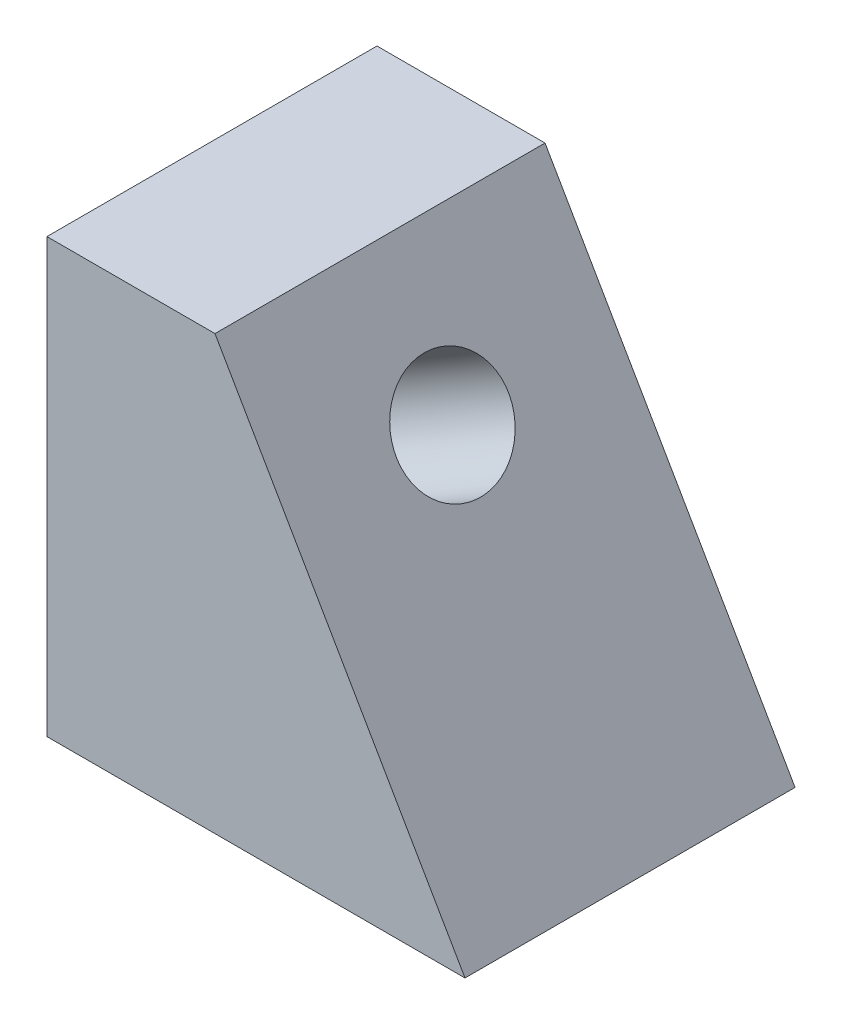
ISO-10303-21;
HEADER;
FILE_DESCRIPTION(('STEP AP214'),'2;1');
FILE_NAME('part.step','',(''),(''),'','','');
FILE_SCHEMA(('AUTOMOTIVE_DESIGN { 1 0 10303 214 1 1 1 1 }'));
ENDSEC;
DATA;
#1=APPLICATION_CONTEXT('core data for automotive mechanical design processes');
#2=APPLICATION_PROTOCOL_DEFINITION('international standard','automotive_design',2000,#1);
#3=PRODUCT_CONTEXT('',#1,'mechanical');
#4=PRODUCT('Part','Part','',(#3));
#5=PRODUCT_RELATED_PRODUCT_CATEGORY('part','',(#4));
#6=PRODUCT_DEFINITION_FORMATION('','',#4);
#7=PRODUCT_DEFINITION_CONTEXT('part definition',#1,'design');
#8=PRODUCT_DEFINITION('design','',#6,#7);
#9=PRODUCT_DEFINITION_SHAPE('','',#8);
#10=(LENGTH_UNIT() NAMED_UNIT(*) SI_UNIT(.MILLI.,.METRE.));
#11=(NAMED_UNIT(*) PLANE_ANGLE_UNIT() SI_UNIT($,.RADIAN.));
#12=(NAMED_UNIT(*) SI_UNIT($,.STERADIAN.) SOLID_ANGLE_UNIT());
#13=UNCERTAINTY_MEASURE_WITH_UNIT(LENGTH_MEASURE(1.E-05),#10,'distance_accuracy_value','');
#14=(GEOMETRIC_REPRESENTATION_CONTEXT(3) GLOBAL_UNCERTAINTY_ASSIGNED_CONTEXT((#13)) GLOBAL_UNIT_ASSIGNED_CONTEXT((#10,
#11,#12)) REPRESENTATION_CONTEXT('',''));
#15=CARTESIAN_POINT('',(0.,0.,0.));
#16=DIRECTION('',(0.,0.,1.));
#17=DIRECTION('',(1.,0.,0.));
#18=AXIS2_PLACEMENT_3D('',#15,#16,#17);
#19=CARTESIAN_POINT('',(0.,0.,50.));
#20=DIRECTION('',(-1.,0.,0.));
#21=DIRECTION('',(0.,0.,1.));
#22=AXIS2_PLACEMENT_3D('',#19,#20,#21);
#23=PLANE('',#22);
#24=CARTESIAN_POINT('',(0.,25.56904553405,25.));
#25=DIRECTION('',(-1.,0.,0.));
#26=DIRECTION('',(0.,1.,0.));
#27=AXIS2_PLACEMENT_3D('',#24,#25,#26);
#28=ELLIPSE('',#27,9.81495457622367,8.5);
#29=CARTESIAN_POINT('',(0.,35.3840001102737,25.));
#30=VERTEX_POINT('',#29);
#31=EDGE_CURVE('E105',#30,#30,#28,.F.);
#32=ORIENTED_EDGE('',*,*,#31,.T.);
#33=EDGE_LOOP('',(#32));
#34=FACE_BOUND('',#33,.T.);
#35=DIRECTION('',(0.,1.,0.));
#36=VECTOR('',#35,1.);
#37=CARTESIAN_POINT('',(0.,0.,0.));
#38=LINE('',#37,#36);
#39=CARTESIAN_POINT('',(0.,0.,0.));
#40=VERTEX_POINT('',#39);
#41=CARTESIAN_POINT('',(0.,65.6065757027782,0.));
#42=VERTEX_POINT('',#41);
#43=EDGE_CURVE('E79',#40,#42,#38,.T.);
#44=ORIENTED_EDGE('',*,*,#43,.F.);
#45=DIRECTION('',(0.,0.,-1.));
#46=VECTOR('',#45,1.);
#47=CARTESIAN_POINT('',(0.,0.,50.));
#48=LINE('',#47,#46);
#49=CARTESIAN_POINT('',(0.,0.,50.));
#50=VERTEX_POINT('',#49);
#51=EDGE_CURVE('E11',#50,#40,#48,.T.);
#52=ORIENTED_EDGE('',*,*,#51,.F.);
#53=DIRECTION('',(0.,1.,0.));
#54=VECTOR('',#53,1.);
#55=CARTESIAN_POINT('',(0.,0.,50.));
#56=LINE('',#55,#54);
#57=CARTESIAN_POINT('',(0.,65.6065757027782,50.));
#58=VERTEX_POINT('',#57);
#59=EDGE_CURVE('E81',#50,#58,#56,.T.);
#60=ORIENTED_EDGE('',*,*,#59,.T.);
#61=DIRECTION('',(0.,0.,-1.));
#62=VECTOR('',#61,1.);
#63=CARTESIAN_POINT('',(0.,65.6065757027782,50.));
#64=LINE('',#63,#62);
#65=EDGE_CURVE('E38',#58,#42,#64,.T.);
#66=ORIENTED_EDGE('',*,*,#65,.T.);
#67=EDGE_LOOP('',(#44,#52,#60,#66));
#68=FACE_BOUND('',#67,.T.);
#69=ADVANCED_FACE('F35',(#34,#68),#23,.T.);
#70=CARTESIAN_POINT('',(0.,0.,50.));
#71=DIRECTION('',(0.,1.,0.));
#72=DIRECTION('',(0.,0.,1.));
#73=AXIS2_PLACEMENT_3D('',#70,#71,#72);
#74=PLANE('',#73);
#75=DIRECTION('',(1.,0.,0.));
#76=VECTOR('',#75,1.);
#77=CARTESIAN_POINT('',(0.,0.,0.));
#78=LINE('',#77,#76);
#79=CARTESIAN_POINT('',(63.335064935065,0.,0.));
#80=VERTEX_POINT('',#79);
#81=EDGE_CURVE('E71',#40,#80,#78,.T.);
#82=ORIENTED_EDGE('',*,*,#81,.T.);
#83=DIRECTION('',(0.,0.,-1.));
#84=VECTOR('',#83,1.);
#85=CARTESIAN_POINT('',(63.335064935065,0.,50.));
#86=LINE('',#85,#84);
#87=CARTESIAN_POINT('',(63.335064935065,0.,50.));
#88=VERTEX_POINT('',#87);
#89=EDGE_CURVE('E44',#88,#80,#86,.T.);
#90=ORIENTED_EDGE('',*,*,#89,.F.);
#91=DIRECTION('',(1.,0.,0.));
#92=VECTOR('',#91,1.);
#93=CARTESIAN_POINT('',(0.,0.,50.));
#94=LINE('',#93,#92);
#95=EDGE_CURVE('E73',#50,#88,#94,.T.);
#96=ORIENTED_EDGE('',*,*,#95,.F.);
#97=ORIENTED_EDGE('',*,*,#51,.T.);
#98=EDGE_LOOP('',(#82,#90,#96,#97));
#99=FACE_BOUND('',#98,.T.);
#100=ADVANCED_FACE('F70',(#99),#74,.F.);
#101=CARTESIAN_POINT('',(0.,65.6065757027782,50.));
#102=DIRECTION('',(0.,1.,0.));
#103=DIRECTION('',(0.,0.,1.));
#104=AXIS2_PLACEMENT_3D('',#101,#102,#103);
#105=PLANE('',#104);
#106=DIRECTION('',(0.,0.,1.));
#107=VECTOR('',#106,1.);
#108=CARTESIAN_POINT('',(25.457090792456,65.6065757027782,-75.7559482852174));
#109=LINE('',#108,#107);
#110=CARTESIAN_POINT('',(25.457090792456,65.6065757027782,0.));
#111=VERTEX_POINT('',#110);
#112=CARTESIAN_POINT('',(25.457090792456,65.6065757027782,50.));
#113=VERTEX_POINT('',#112);
#114=EDGE_CURVE('E87',#111,#113,#109,.T.);
#115=ORIENTED_EDGE('',*,*,#114,.F.);
#116=DIRECTION('',(1.,0.,0.));
#117=VECTOR('',#116,1.);
#118=CARTESIAN_POINT('',(0.,65.6065757027782,0.));
#119=LINE('',#118,#117);
#120=EDGE_CURVE('E82',#42,#111,#119,.T.);
#121=ORIENTED_EDGE('',*,*,#120,.F.);
#122=ORIENTED_EDGE('',*,*,#65,.F.);
#123=DIRECTION('',(1.,0.,0.));
#124=VECTOR('',#123,1.);
#125=CARTESIAN_POINT('',(0.,65.6065757027782,50.));
#126=LINE('',#125,#124);
#127=EDGE_CURVE('E91',#58,#113,#126,.T.);
#128=ORIENTED_EDGE('',*,*,#127,.T.);
#129=EDGE_LOOP('',(#115,#121,#122,#128));
#130=FACE_BOUND('',#129,.T.);
#131=ADVANCED_FACE('F121',(#130),#105,.T.);
#132=CARTESIAN_POINT('',(0.,0.,50.));
#133=DIRECTION('',(0.,0.,-1.));
#134=DIRECTION('',(-1.,0.,0.));
#135=AXIS2_PLACEMENT_3D('',#132,#133,#134);
#136=PLANE('',#135);
#137=ORIENTED_EDGE('',*,*,#95,.T.);
#138=DIRECTION('',(0.500000000000004,-0.866025403784436,0.));
#139=VECTOR('',#138,1.);
#140=CARTESIAN_POINT('',(25.457090792456,65.6065757027782,50.));
#141=LINE('',#140,#139);
#142=EDGE_CURVE('E102',#113,#88,#141,.T.);
#143=ORIENTED_EDGE('',*,*,#142,.F.);
#144=ORIENTED_EDGE('',*,*,#127,.F.);
#145=ORIENTED_EDGE('',*,*,#59,.F.);
#146=EDGE_LOOP('',(#137,#143,#144,#145));
#147=FACE_BOUND('',#146,.T.);
#148=ADVANCED_FACE('F119',(#147),#136,.F.);
#149=CARTESIAN_POINT('',(0.,0.,0.));
#150=DIRECTION('',(0.,0.,-1.));
#151=DIRECTION('',(-1.,0.,0.));
#152=AXIS2_PLACEMENT_3D('',#149,#150,#151);
#153=PLANE('',#152);
#154=DIRECTION('',(0.500000000000004,-0.866025403784436,0.));
#155=VECTOR('',#154,1.);
#156=CARTESIAN_POINT('',(25.457090792456,65.6065757027782,0.));
#157=LINE('',#156,#155);
#158=EDGE_CURVE('E80',#111,#80,#157,.T.);
#159=ORIENTED_EDGE('',*,*,#158,.T.);
#160=ORIENTED_EDGE('',*,*,#81,.F.);
#161=ORIENTED_EDGE('',*,*,#43,.T.);
#162=ORIENTED_EDGE('',*,*,#120,.T.);
#163=EDGE_LOOP('',(#159,#160,#161,#162));
#164=FACE_BOUND('',#163,.T.);
#165=ADVANCED_FACE('F77',(#164),#153,.T.);
#166=CARTESIAN_POINT('',(25.457090792456,65.6065757027782,-75.7559482852174));
#167=DIRECTION('',(-0.866025403784436,-0.500000000000004,0.));
#168=DIRECTION('',(0.500000000000004,-0.866025403784436,0.));
#169=AXIS2_PLACEMENT_3D('',#166,#167,#168);
#170=PLANE('',#169);
#171=CARTESIAN_POINT('',(36.4295772097942,46.6016717425892,25.));
#172=DIRECTION('',(0.866025403784436,0.500000000000004,0.));
#173=DIRECTION('',(-0.500000000000004,0.866025403784436,0.));
#174=AXIS2_PLACEMENT_3D('',#171,#172,#173);
#175=CIRCLE('',#174,8.5);
#176=CARTESIAN_POINT('',(32.1795772097942,53.9628876747569,25.));
#177=VERTEX_POINT('',#176);
#178=EDGE_CURVE('E108',#177,#177,#175,.T.);
#179=ORIENTED_EDGE('',*,*,#178,.F.);
#180=EDGE_LOOP('',(#179));
#181=FACE_BOUND('',#180,.T.);
#182=ORIENTED_EDGE('',*,*,#114,.T.);
#183=ORIENTED_EDGE('',*,*,#142,.T.);
#184=ORIENTED_EDGE('',*,*,#89,.T.);
#185=ORIENTED_EDGE('',*,*,#158,.F.);
#186=EDGE_LOOP('',(#182,#183,#184,#185));
#187=FACE_BOUND('',#186,.T.);
#188=ADVANCED_FACE('F115',(#181,#187),#170,.F.);
#189=CARTESIAN_POINT('',(-22.4311466869998,12.6184169560786,25.));
#190=DIRECTION('',(0.866025403784436,0.500000000000004,0.));
#191=DIRECTION('',(-0.500000000000004,0.866025403784436,0.));
#192=AXIS2_PLACEMENT_3D('',#189,#190,#191);
#193=CYLINDRICAL_SURFACE('',#192,8.5);
#194=ORIENTED_EDGE('',*,*,#178,.T.);
#195=EDGE_LOOP('',(#194));
#196=FACE_BOUND('',#195,.T.);
#197=ORIENTED_EDGE('',*,*,#31,.F.);
#198=EDGE_LOOP('',(#197));
#199=FACE_BOUND('',#198,.T.);
#200=ADVANCED_FACE('F112',(#196,#199),#193,.F.);
#201=CLOSED_SHELL('',(#69,#100,#131,#148,#165,#188,#200));
#202=MANIFOLD_SOLID_BREP('B2',#201);
#203=ADVANCED_BREP_SHAPE_REPRESENTATION('',(#18,#202),#14);
#204=SHAPE_DEFINITION_REPRESENTATION(#9,#203);
ENDSEC;
END-ISO-10303-21;
